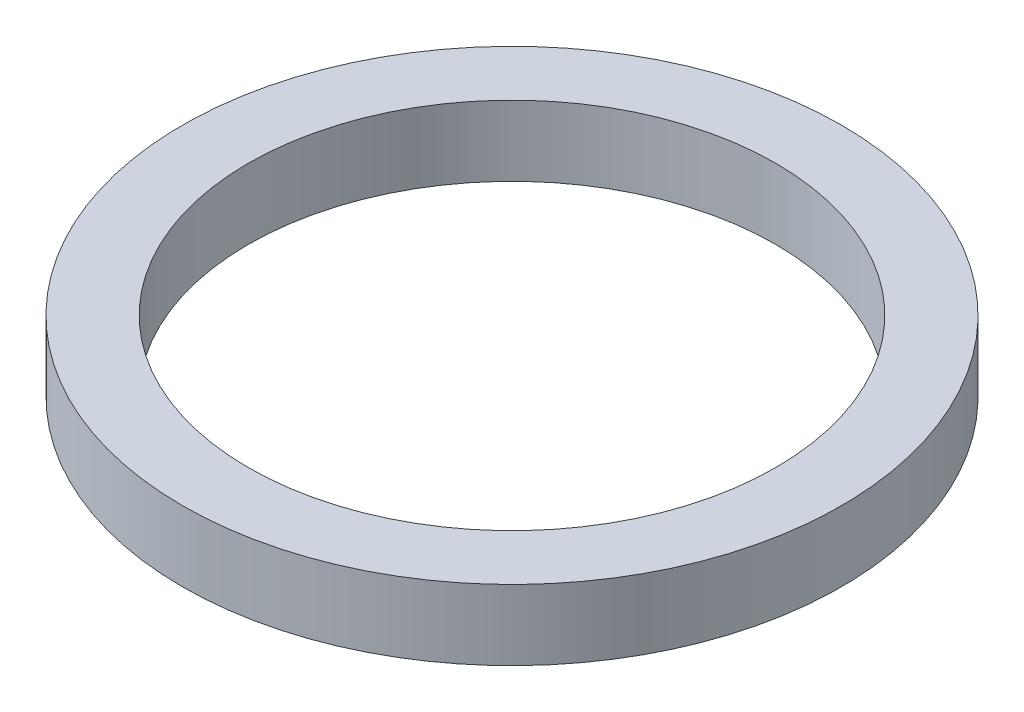
ISO-10303-21;
HEADER;
FILE_DESCRIPTION(('STEP AP214'),'2;1');
FILE_NAME('part.step','',(''),(''),'','','');
FILE_SCHEMA(('AUTOMOTIVE_DESIGN { 1 0 10303 214 1 1 1 1 }'));
ENDSEC;
DATA;
#1=APPLICATION_CONTEXT('core data for automotive mechanical design processes');
#2=APPLICATION_PROTOCOL_DEFINITION('international standard','automotive_design',2000,#1);
#3=PRODUCT_CONTEXT('',#1,'mechanical');
#4=PRODUCT('Part','Part','',(#3));
#5=PRODUCT_RELATED_PRODUCT_CATEGORY('part','',(#4));
#6=PRODUCT_DEFINITION_FORMATION('','',#4);
#7=PRODUCT_DEFINITION_CONTEXT('part definition',#1,'design');
#8=PRODUCT_DEFINITION('design','',#6,#7);
#9=PRODUCT_DEFINITION_SHAPE('','',#8);
#10=(LENGTH_UNIT() NAMED_UNIT(*) SI_UNIT(.MILLI.,.METRE.));
#11=(NAMED_UNIT(*) PLANE_ANGLE_UNIT() SI_UNIT($,.RADIAN.));
#12=(NAMED_UNIT(*) SI_UNIT($,.STERADIAN.) SOLID_ANGLE_UNIT());
#13=UNCERTAINTY_MEASURE_WITH_UNIT(LENGTH_MEASURE(1.E-05),#10,'distance_accuracy_value','');
#14=(GEOMETRIC_REPRESENTATION_CONTEXT(3) GLOBAL_UNCERTAINTY_ASSIGNED_CONTEXT((#13)) GLOBAL_UNIT_ASSIGNED_CONTEXT((#10,
#11,#12)) REPRESENTATION_CONTEXT('',''));
#15=CARTESIAN_POINT('',(0.,0.,0.));
#16=DIRECTION('',(0.,0.,1.));
#17=DIRECTION('',(1.,0.,0.));
#18=AXIS2_PLACEMENT_3D('',#15,#16,#17);
#19=CARTESIAN_POINT('',(0.,16.,0.));
#20=DIRECTION('',(0.,1.,0.));
#21=DIRECTION('',(0.,0.,1.));
#22=AXIS2_PLACEMENT_3D('',#19,#20,#21);
#23=PLANE('',#22);
#24=CARTESIAN_POINT('',(0.,16.,0.));
#25=DIRECTION('',(0.,1.,0.));
#26=DIRECTION('',(0.,0.,1.));
#27=AXIS2_PLACEMENT_3D('',#24,#25,#26);
#28=CIRCLE('',#27,75.);
#29=CARTESIAN_POINT('',(0.,16.,75.));
#30=VERTEX_POINT('',#29);
#31=EDGE_CURVE('E10',#30,#30,#28,.T.);
#32=ORIENTED_EDGE('',*,*,#31,.T.);
#33=EDGE_LOOP('',(#32));
#34=FACE_BOUND('',#33,.T.);
#35=CARTESIAN_POINT('',(0.,16.,0.));
#36=DIRECTION('',(0.,1.,0.));
#37=DIRECTION('',(0.,0.,1.));
#38=AXIS2_PLACEMENT_3D('',#35,#36,#37);
#39=CIRCLE('',#38,60.);
#40=CARTESIAN_POINT('',(0.,16.,60.));
#41=VERTEX_POINT('',#40);
#42=EDGE_CURVE('E55',#41,#41,#39,.T.);
#43=ORIENTED_EDGE('',*,*,#42,.F.);
#44=EDGE_LOOP('',(#43));
#45=FACE_BOUND('',#44,.T.);
#46=ADVANCED_FACE('F41',(#34,#45),#23,.T.);
#47=CARTESIAN_POINT('',(0.,0.,0.));
#48=DIRECTION('',(0.,1.,0.));
#49=DIRECTION('',(0.,0.,1.));
#50=AXIS2_PLACEMENT_3D('',#47,#48,#49);
#51=PLANE('',#50);
#52=CARTESIAN_POINT('',(0.,0.,0.));
#53=DIRECTION('',(0.,1.,0.));
#54=DIRECTION('',(0.,0.,1.));
#55=AXIS2_PLACEMENT_3D('',#52,#53,#54);
#56=CIRCLE('',#55,75.);
#57=CARTESIAN_POINT('',(0.,0.,75.));
#58=VERTEX_POINT('',#57);
#59=EDGE_CURVE('E45',#58,#58,#56,.T.);
#60=ORIENTED_EDGE('',*,*,#59,.F.);
#61=EDGE_LOOP('',(#60));
#62=FACE_BOUND('',#61,.T.);
#63=CARTESIAN_POINT('',(0.,0.,0.));
#64=DIRECTION('',(0.,1.,0.));
#65=DIRECTION('',(0.,0.,1.));
#66=AXIS2_PLACEMENT_3D('',#63,#64,#65);
#67=CIRCLE('',#66,60.);
#68=CARTESIAN_POINT('',(0.,0.,60.));
#69=VERTEX_POINT('',#68);
#70=EDGE_CURVE('E57',#69,#69,#67,.T.);
#71=ORIENTED_EDGE('',*,*,#70,.T.);
#72=EDGE_LOOP('',(#71));
#73=FACE_BOUND('',#72,.T.);
#74=ADVANCED_FACE('F68',(#62,#73),#51,.F.);
#75=CARTESIAN_POINT('',(0.,16.,0.));
#76=DIRECTION('',(0.,-1.,0.));
#77=DIRECTION('',(0.,0.,-1.));
#78=AXIS2_PLACEMENT_3D('',#75,#76,#77);
#79=CYLINDRICAL_SURFACE('',#78,75.);
#80=ORIENTED_EDGE('',*,*,#31,.F.);
#81=EDGE_LOOP('',(#80));
#82=FACE_BOUND('',#81,.T.);
#83=ORIENTED_EDGE('',*,*,#59,.T.);
#84=EDGE_LOOP('',(#83));
#85=FACE_BOUND('',#84,.T.);
#86=ADVANCED_FACE('F43',(#82,#85),#79,.T.);
#87=CARTESIAN_POINT('',(0.,16.,0.));
#88=DIRECTION('',(0.,-1.,0.));
#89=DIRECTION('',(0.,0.,-1.));
#90=AXIS2_PLACEMENT_3D('',#87,#88,#89);
#91=CYLINDRICAL_SURFACE('',#90,60.);
#92=ORIENTED_EDGE('',*,*,#42,.T.);
#93=EDGE_LOOP('',(#92));
#94=FACE_BOUND('',#93,.T.);
#95=ORIENTED_EDGE('',*,*,#70,.F.);
#96=EDGE_LOOP('',(#95));
#97=FACE_BOUND('',#96,.T.);
#98=ADVANCED_FACE('F64',(#94,#97),#91,.F.);
#99=CLOSED_SHELL('',(#46,#74,#86,#98));
#100=MANIFOLD_SOLID_BREP('B2',#99);
#101=ADVANCED_BREP_SHAPE_REPRESENTATION('',(#18,#100),#14);
#102=SHAPE_DEFINITION_REPRESENTATION(#9,#101);
ENDSEC;
END-ISO-10303-21;
